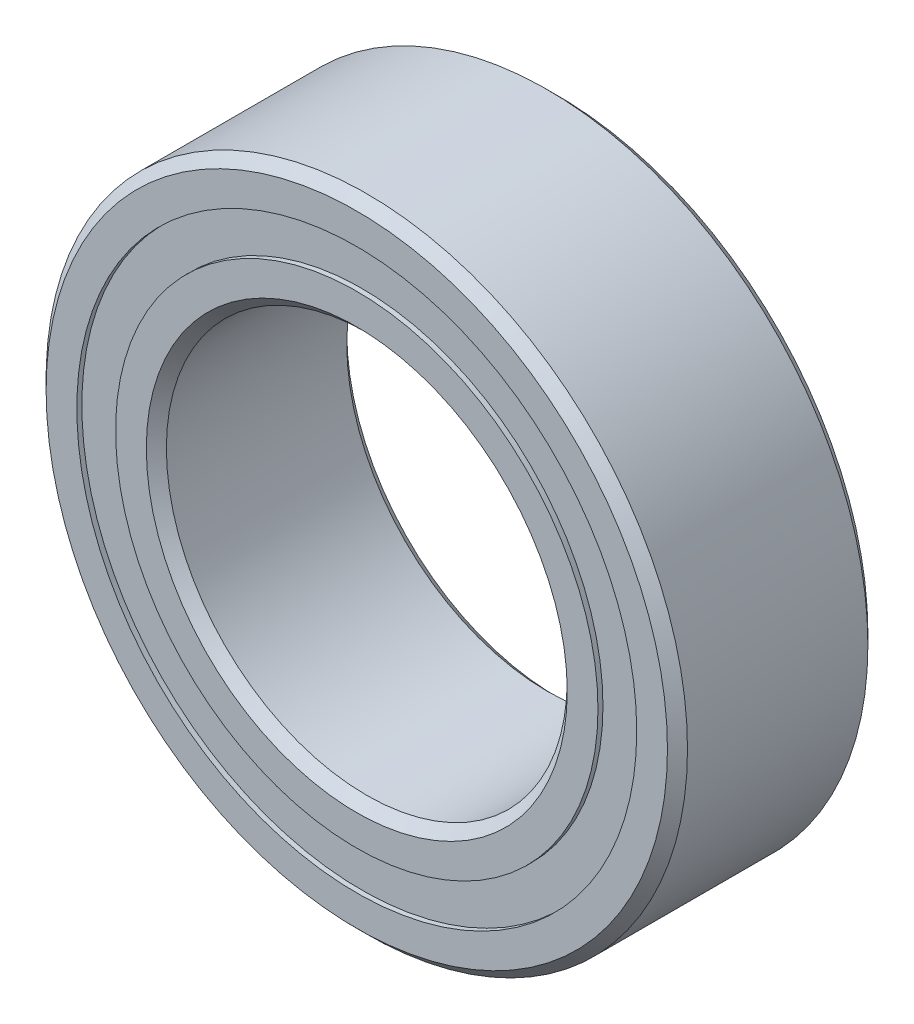
ISO-10303-21;
HEADER;
FILE_DESCRIPTION(('STEP AP214'),'2;1');
FILE_NAME('part.step','',(''),(''),'','','');
FILE_SCHEMA(('AUTOMOTIVE_DESIGN { 1 0 10303 214 1 1 1 1 }'));
ENDSEC;
DATA;
#1=APPLICATION_CONTEXT('core data for automotive mechanical design processes');
#2=APPLICATION_PROTOCOL_DEFINITION('international standard','automotive_design',2000,#1);
#3=PRODUCT_CONTEXT('',#1,'mechanical');
#4=PRODUCT('Part','Part','',(#3));
#5=PRODUCT_RELATED_PRODUCT_CATEGORY('part','',(#4));
#6=PRODUCT_DEFINITION_FORMATION('','',#4);
#7=PRODUCT_DEFINITION_CONTEXT('part definition',#1,'design');
#8=PRODUCT_DEFINITION('design','',#6,#7);
#9=PRODUCT_DEFINITION_SHAPE('','',#8);
#10=(LENGTH_UNIT() NAMED_UNIT(*) SI_UNIT(.MILLI.,.METRE.));
#11=(NAMED_UNIT(*) PLANE_ANGLE_UNIT() SI_UNIT($,.RADIAN.));
#12=(NAMED_UNIT(*) SI_UNIT($,.STERADIAN.) SOLID_ANGLE_UNIT());
#13=UNCERTAINTY_MEASURE_WITH_UNIT(LENGTH_MEASURE(1.E-05),#10,'distance_accuracy_value','');
#14=(GEOMETRIC_REPRESENTATION_CONTEXT(3) GLOBAL_UNCERTAINTY_ASSIGNED_CONTEXT((#13)) GLOBAL_UNIT_ASSIGNED_CONTEXT((#10,
#11,#12)) REPRESENTATION_CONTEXT('',''));
#15=CARTESIAN_POINT('',(0.,0.,0.));
#16=DIRECTION('',(0.,0.,1.));
#17=DIRECTION('',(1.,0.,0.));
#18=AXIS2_PLACEMENT_3D('',#15,#16,#17);
#19=CARTESIAN_POINT('',(0.,3.49175824175824,-1.1875));
#20=DIRECTION('',(0.,0.,1.));
#21=DIRECTION('',(1.,0.,0.));
#22=AXIS2_PLACEMENT_3D('',#19,#20,#21);
#23=PLANE('',#22);
#24=CARTESIAN_POINT('',(0.,0.,-1.1875));
#25=DIRECTION('',(0.,0.,1.));
#26=DIRECTION('',(1.,0.,0.));
#27=AXIS2_PLACEMENT_3D('',#24,#25,#26);
#28=CIRCLE('',#27,3.49175824175824);
#29=CARTESIAN_POINT('',(3.49175824175824,0.,-1.1875));
#30=VERTEX_POINT('',#29);
#31=EDGE_CURVE('E55',#30,#30,#28,.T.);
#32=ORIENTED_EDGE('',*,*,#31,.F.);
#33=EDGE_LOOP('',(#32));
#34=FACE_BOUND('',#33,.T.);
#35=CARTESIAN_POINT('',(0.,0.,-1.1875));
#36=DIRECTION('',(0.,0.,1.));
#37=DIRECTION('',(1.,0.,0.));
#38=AXIS2_PLACEMENT_3D('',#35,#36,#37);
#39=CIRCLE('',#38,3.00824175824176);
#40=CARTESIAN_POINT('',(3.00824175824176,0.,-1.1875));
#41=VERTEX_POINT('',#40);
#42=EDGE_CURVE('E11',#41,#41,#39,.T.);
#43=ORIENTED_EDGE('',*,*,#42,.T.);
#44=EDGE_LOOP('',(#43));
#45=FACE_BOUND('',#44,.T.);
#46=ADVANCED_FACE('F41',(#34,#45),#23,.F.);
#47=CARTESIAN_POINT('',(0.,0.,1.25));
#48=DIRECTION('',(0.,0.,1.));
#49=DIRECTION('',(1.,0.,0.));
#50=AXIS2_PLACEMENT_3D('',#47,#48,#49);
#51=CYLINDRICAL_SURFACE('',#50,3.00824175824176);
#52=ORIENTED_EDGE('',*,*,#42,.F.);
#53=EDGE_LOOP('',(#52));
#54=FACE_BOUND('',#53,.T.);
#55=CARTESIAN_POINT('',(0.,0.,-0.605878719519575));
#56=DIRECTION('',(0.,0.,1.));
#57=DIRECTION('',(1.,0.,0.));
#58=AXIS2_PLACEMENT_3D('',#55,#56,#57);
#59=CIRCLE('',#58,3.00824175824176);
#60=CARTESIAN_POINT('',(3.00824175824176,0.,-0.605878719519575));
#61=VERTEX_POINT('',#60);
#62=EDGE_CURVE('E47',#61,#61,#59,.T.);
#63=ORIENTED_EDGE('',*,*,#62,.T.);
#64=EDGE_LOOP('',(#63));
#65=FACE_BOUND('',#64,.T.);
#66=ADVANCED_FACE('F64',(#54,#65),#51,.F.);
#67=CARTESIAN_POINT('',(0.,3.49175824175824,-0.605878719519575));
#68=DIRECTION('',(0.,0.,-1.));
#69=DIRECTION('',(-1.,0.,0.));
#70=AXIS2_PLACEMENT_3D('',#67,#68,#69);
#71=PLANE('',#70);
#72=ORIENTED_EDGE('',*,*,#62,.F.);
#73=EDGE_LOOP('',(#72));
#74=FACE_BOUND('',#73,.T.);
#75=CARTESIAN_POINT('',(0.,0.,-0.605878719519575));
#76=DIRECTION('',(0.,0.,1.));
#77=DIRECTION('',(1.,0.,0.));
#78=AXIS2_PLACEMENT_3D('',#75,#76,#77);
#79=CIRCLE('',#78,3.49175824175824);
#80=CARTESIAN_POINT('',(3.49175824175824,0.,-0.605878719519575));
#81=VERTEX_POINT('',#80);
#82=EDGE_CURVE('E51',#81,#81,#79,.T.);
#83=ORIENTED_EDGE('',*,*,#82,.T.);
#84=EDGE_LOOP('',(#83));
#85=FACE_BOUND('',#84,.T.);
#86=ADVANCED_FACE('F68',(#74,#85),#71,.F.);
#87=CARTESIAN_POINT('',(0.,0.,1.25));
#88=DIRECTION('',(0.,0.,1.));
#89=DIRECTION('',(1.,0.,0.));
#90=AXIS2_PLACEMENT_3D('',#87,#88,#89);
#91=CYLINDRICAL_SURFACE('',#90,3.49175824175824);
#92=ORIENTED_EDGE('',*,*,#82,.F.);
#93=EDGE_LOOP('',(#92));
#94=FACE_BOUND('',#93,.T.);
#95=ORIENTED_EDGE('',*,*,#31,.T.);
#96=EDGE_LOOP('',(#95));
#97=FACE_BOUND('',#96,.T.);
#98=ADVANCED_FACE('F61',(#94,#97),#91,.T.);
#99=CLOSED_SHELL('',(#46,#66,#86,#98));
#100=MANIFOLD_SOLID_BREP('B2',#99);
#101=CARTESIAN_POINT('',(0.,3.49175824175824,1.1875));
#102=DIRECTION('',(0.,0.,-1.));
#103=DIRECTION('',(-1.,0.,0.));
#104=AXIS2_PLACEMENT_3D('',#101,#102,#103);
#105=PLANE('',#104);
#106=CARTESIAN_POINT('',(0.,0.,1.1875));
#107=DIRECTION('',(0.,0.,1.));
#108=DIRECTION('',(1.,0.,0.));
#109=AXIS2_PLACEMENT_3D('',#106,#107,#108);
#110=CIRCLE('',#109,3.00824175824176);
#111=CARTESIAN_POINT('',(3.00824175824176,0.,1.1875));
#112=VERTEX_POINT('',#111);
#113=EDGE_CURVE('E40',#112,#112,#110,.T.);
#114=ORIENTED_EDGE('',*,*,#113,.F.);
#115=EDGE_LOOP('',(#114));
#116=FACE_BOUND('',#115,.T.);
#117=CARTESIAN_POINT('',(0.,0.,1.1875));
#118=DIRECTION('',(0.,0.,1.));
#119=DIRECTION('',(1.,0.,0.));
#120=AXIS2_PLACEMENT_3D('',#117,#118,#119);
#121=CIRCLE('',#120,3.49175824175824);
#122=CARTESIAN_POINT('',(3.49175824175824,0.,1.1875));
#123=VERTEX_POINT('',#122);
#124=EDGE_CURVE('E122',#123,#123,#121,.T.);
#125=ORIENTED_EDGE('',*,*,#124,.T.);
#126=EDGE_LOOP('',(#125));
#127=FACE_BOUND('',#126,.T.);
#128=ADVANCED_FACE('F108',(#116,#127),#105,.F.);
#129=CARTESIAN_POINT('',(0.,0.,1.25));
#130=DIRECTION('',(0.,0.,1.));
#131=DIRECTION('',(1.,0.,0.));
#132=AXIS2_PLACEMENT_3D('',#129,#130,#131);
#133=CYLINDRICAL_SURFACE('',#132,3.00824175824176);
#134=CARTESIAN_POINT('',(0.,0.,0.605878719519573));
#135=DIRECTION('',(0.,0.,1.));
#136=DIRECTION('',(1.,0.,0.));
#137=AXIS2_PLACEMENT_3D('',#134,#135,#136);
#138=CIRCLE('',#137,3.00824175824176);
#139=CARTESIAN_POINT('',(3.00824175824176,0.,0.605878719519573));
#140=VERTEX_POINT('',#139);
#141=EDGE_CURVE('E114',#140,#140,#138,.T.);
#142=ORIENTED_EDGE('',*,*,#141,.F.);
#143=EDGE_LOOP('',(#142));
#144=FACE_BOUND('',#143,.T.);
#145=ORIENTED_EDGE('',*,*,#113,.T.);
#146=EDGE_LOOP('',(#145));
#147=FACE_BOUND('',#146,.T.);
#148=ADVANCED_FACE('F137',(#144,#147),#133,.F.);
#149=CARTESIAN_POINT('',(0.,3.49175824175824,0.605878719519573));
#150=DIRECTION('',(0.,0.,1.));
#151=DIRECTION('',(1.,0.,0.));
#152=AXIS2_PLACEMENT_3D('',#149,#150,#151);
#153=PLANE('',#152);
#154=CARTESIAN_POINT('',(0.,0.,0.605878719519573));
#155=DIRECTION('',(0.,0.,1.));
#156=DIRECTION('',(1.,0.,0.));
#157=AXIS2_PLACEMENT_3D('',#154,#155,#156);
#158=CIRCLE('',#157,3.49175824175824);
#159=CARTESIAN_POINT('',(3.49175824175824,0.,0.605878719519573));
#160=VERTEX_POINT('',#159);
#161=EDGE_CURVE('E118',#160,#160,#158,.T.);
#162=ORIENTED_EDGE('',*,*,#161,.F.);
#163=EDGE_LOOP('',(#162));
#164=FACE_BOUND('',#163,.T.);
#165=ORIENTED_EDGE('',*,*,#141,.T.);
#166=EDGE_LOOP('',(#165));
#167=FACE_BOUND('',#166,.T.);
#168=ADVANCED_FACE('F132',(#164,#167),#153,.F.);
#169=CARTESIAN_POINT('',(0.,0.,1.25));
#170=DIRECTION('',(0.,0.,1.));
#171=DIRECTION('',(1.,0.,0.));
#172=AXIS2_PLACEMENT_3D('',#169,#170,#171);
#173=CYLINDRICAL_SURFACE('',#172,3.49175824175824);
#174=ORIENTED_EDGE('',*,*,#124,.F.);
#175=EDGE_LOOP('',(#174));
#176=FACE_BOUND('',#175,.T.);
#177=ORIENTED_EDGE('',*,*,#161,.T.);
#178=EDGE_LOOP('',(#177));
#179=FACE_BOUND('',#178,.T.);
#180=ADVANCED_FACE('F129',(#176,#179),#173,.T.);
#181=CLOSED_SHELL('',(#128,#148,#168,#180));
#182=MANIFOLD_SOLID_BREP('B6',#181);
#183=CARTESIAN_POINT('',(-1.62499999999996,2.81458256229945,0.));
#184=DIRECTION('',(0.,0.,1.));
#185=DIRECTION('',(-0.499999999999989,0.866025403784445,0.));
#186=AXIS2_PLACEMENT_3D('',#183,#184,#185);
#187=SPHERICAL_SURFACE('',#186,0.605878719519574);
#188=CARTESIAN_POINT('',(-1.62499999999996,2.81458256229945,0.605878719519573));
#189=VERTEX_POINT('',#188);
#190=VERTEX_LOOP('',#189);
#191=FACE_BOUND('',#190,.T.);
#192=ADVANCED_FACE('F175',(#191),#187,.T.);
#193=CLOSED_SHELL('',(#192));
#194=MANIFOLD_SOLID_BREP('B35',#193);
#195=CARTESIAN_POINT('',(-2.81458256229941,1.62500000000003,0.));
#196=DIRECTION('',(0.,0.,1.));
#197=DIRECTION('',(-0.866025403784433,0.50000000000001,0.));
#198=AXIS2_PLACEMENT_3D('',#195,#196,#197);
#199=SPHERICAL_SURFACE('',#198,0.605878719519574);
#200=CARTESIAN_POINT('',(-2.81458256229941,1.62500000000003,0.605878719519573));
#201=VERTEX_POINT('',#200);
#202=VERTEX_LOOP('',#201);
#203=FACE_BOUND('',#202,.T.);
#204=ADVANCED_FACE('F195',(#203),#199,.T.);
#205=CLOSED_SHELL('',(#204));
#206=MANIFOLD_SOLID_BREP('B104',#205);
#207=CARTESIAN_POINT('',(-3.25,0.,0.));
#208=DIRECTION('',(0.,0.,1.));
#209=DIRECTION('',(-1.,0.,0.));
#210=AXIS2_PLACEMENT_3D('',#207,#208,#209);
#211=SPHERICAL_SURFACE('',#210,0.605878719519574);
#212=CARTESIAN_POINT('',(-3.25,0.,0.605878719519573));
#213=VERTEX_POINT('',#212);
#214=VERTEX_LOOP('',#213);
#215=FACE_BOUND('',#214,.T.);
#216=ADVANCED_FACE('F215',(#215),#211,.T.);
#217=CLOSED_SHELL('',(#216));
#218=MANIFOLD_SOLID_BREP('B171',#217);
#219=CARTESIAN_POINT('',(-2.81458256229944,-1.62499999999997,0.));
#220=DIRECTION('',(0.,0.,1.));
#221=DIRECTION('',(-0.866025403784443,-0.499999999999992,0.));
#222=AXIS2_PLACEMENT_3D('',#219,#220,#221);
#223=SPHERICAL_SURFACE('',#222,0.605878719519574);
#224=CARTESIAN_POINT('',(-2.81458256229944,-1.62499999999997,0.605878719519573));
#225=VERTEX_POINT('',#224);
#226=VERTEX_LOOP('',#225);
#227=FACE_BOUND('',#226,.T.);
#228=ADVANCED_FACE('F235',(#227),#223,.T.);
#229=CLOSED_SHELL('',(#228));
#230=MANIFOLD_SOLID_BREP('B191',#229);
#231=CARTESIAN_POINT('',(-1.62500000000002,-2.81458256229941,0.));
#232=DIRECTION('',(0.,0.,1.));
#233=DIRECTION('',(-0.500000000000007,-0.866025403784435,0.));
#234=AXIS2_PLACEMENT_3D('',#231,#232,#233);
#235=SPHERICAL_SURFACE('',#234,0.605878719519574);
#236=CARTESIAN_POINT('',(-1.62500000000002,-2.81458256229941,0.605878719519573));
#237=VERTEX_POINT('',#236);
#238=VERTEX_LOOP('',#237);
#239=FACE_BOUND('',#238,.T.);
#240=ADVANCED_FACE('F255',(#239),#235,.T.);
#241=CLOSED_SHELL('',(#240));
#242=MANIFOLD_SOLID_BREP('B211',#241);
#243=CARTESIAN_POINT('',(0.,-3.25,0.));
#244=DIRECTION('',(0.,0.,1.));
#245=DIRECTION('',(0.,-1.,0.));
#246=AXIS2_PLACEMENT_3D('',#243,#244,#245);
#247=SPHERICAL_SURFACE('',#246,0.605878719519574);
#248=CARTESIAN_POINT('',(0.,-3.25,0.605878719519573));
#249=VERTEX_POINT('',#248);
#250=VERTEX_LOOP('',#249);
#251=FACE_BOUND('',#250,.T.);
#252=ADVANCED_FACE('F275',(#251),#247,.T.);
#253=CLOSED_SHELL('',(#252));
#254=MANIFOLD_SOLID_BREP('B231',#253);
#255=CARTESIAN_POINT('',(1.62499999999998,-2.81458256229944,0.));
#256=DIRECTION('',(0.,0.,1.));
#257=DIRECTION('',(0.499999999999995,-0.866025403784442,0.));
#258=AXIS2_PLACEMENT_3D('',#255,#256,#257);
#259=SPHERICAL_SURFACE('',#258,0.605878719519574);
#260=CARTESIAN_POINT('',(1.62499999999998,-2.81458256229944,0.605878719519573));
#261=VERTEX_POINT('',#260);
#262=VERTEX_LOOP('',#261);
#263=FACE_BOUND('',#262,.T.);
#264=ADVANCED_FACE('F295',(#263),#259,.T.);
#265=CLOSED_SHELL('',(#264));
#266=MANIFOLD_SOLID_BREP('B251',#265);
#267=CARTESIAN_POINT('',(2.81458256229942,-1.62500000000001,0.));
#268=DIRECTION('',(0.,0.,1.));
#269=DIRECTION('',(0.866025403784436,-0.500000000000004,0.));
#270=AXIS2_PLACEMENT_3D('',#267,#268,#269);
#271=SPHERICAL_SURFACE('',#270,0.605878719519574);
#272=CARTESIAN_POINT('',(2.81458256229942,-1.62500000000001,0.605878719519573));
#273=VERTEX_POINT('',#272);
#274=VERTEX_LOOP('',#273);
#275=FACE_BOUND('',#274,.T.);
#276=ADVANCED_FACE('F315',(#275),#271,.T.);
#277=CLOSED_SHELL('',(#276));
#278=MANIFOLD_SOLID_BREP('B271',#277);
#279=CARTESIAN_POINT('',(3.25,0.,0.));
#280=DIRECTION('',(0.,0.,1.));
#281=DIRECTION('',(1.,0.,0.));
#282=AXIS2_PLACEMENT_3D('',#279,#280,#281);
#283=SPHERICAL_SURFACE('',#282,0.605878719519574);
#284=CARTESIAN_POINT('',(3.25,0.,0.605878719519573));
#285=VERTEX_POINT('',#284);
#286=VERTEX_LOOP('',#285);
#287=FACE_BOUND('',#286,.T.);
#288=ADVANCED_FACE('F335',(#287),#283,.T.);
#289=CLOSED_SHELL('',(#288));
#290=MANIFOLD_SOLID_BREP('B291',#289);
#291=CARTESIAN_POINT('',(2.81458256229943,1.62499999999999,0.));
#292=DIRECTION('',(0.,0.,1.));
#293=DIRECTION('',(0.86602540378444,0.499999999999998,0.));
#294=AXIS2_PLACEMENT_3D('',#291,#292,#293);
#295=SPHERICAL_SURFACE('',#294,0.605878719519574);
#296=CARTESIAN_POINT('',(2.81458256229943,1.62499999999999,0.605878719519573));
#297=VERTEX_POINT('',#296);
#298=VERTEX_LOOP('',#297);
#299=FACE_BOUND('',#298,.T.);
#300=ADVANCED_FACE('F355',(#299),#295,.T.);
#301=CLOSED_SHELL('',(#300));
#302=MANIFOLD_SOLID_BREP('B311',#301);
#303=CARTESIAN_POINT('',(1.625,2.81458256229942,0.));
#304=DIRECTION('',(0.,0.,1.));
#305=DIRECTION('',(0.500000000000001,0.866025403784438,0.));
#306=AXIS2_PLACEMENT_3D('',#303,#304,#305);
#307=SPHERICAL_SURFACE('',#306,0.605878719519574);
#308=CARTESIAN_POINT('',(1.625,2.81458256229942,0.605878719519573));
#309=VERTEX_POINT('',#308);
#310=VERTEX_LOOP('',#309);
#311=FACE_BOUND('',#310,.T.);
#312=ADVANCED_FACE('F375',(#311),#307,.T.);
#313=CLOSED_SHELL('',(#312));
#314=MANIFOLD_SOLID_BREP('B331',#313);
#315=CARTESIAN_POINT('',(0.,3.25,0.));
#316=DIRECTION('',(0.,0.,1.));
#317=DIRECTION('',(0.,1.,0.));
#318=AXIS2_PLACEMENT_3D('',#315,#316,#317);
#319=SPHERICAL_SURFACE('',#318,0.605878719519574);
#320=CARTESIAN_POINT('',(0.,3.25,0.605878719519573));
#321=VERTEX_POINT('',#320);
#322=VERTEX_LOOP('',#321);
#323=FACE_BOUND('',#322,.T.);
#324=ADVANCED_FACE('F397',(#323),#319,.T.);
#325=CLOSED_SHELL('',(#324));
#326=MANIFOLD_SOLID_BREP('B351',#325);
#327=CARTESIAN_POINT('',(0.,3.00824175824176,1.25));
#328=DIRECTION('',(0.,0.,-1.));
#329=DIRECTION('',(-1.,0.,0.));
#330=AXIS2_PLACEMENT_3D('',#327,#328,#329);
#331=PLANE('',#330);
#332=CARTESIAN_POINT('',(0.,0.,1.25));
#333=DIRECTION('',(0.,0.,1.));
#334=DIRECTION('',(1.,0.,0.));
#335=AXIS2_PLACEMENT_3D('',#332,#333,#334);
#336=CIRCLE('',#335,2.625);
#337=CARTESIAN_POINT('',(2.625,0.,1.25));
#338=VERTEX_POINT('',#337);
#339=EDGE_CURVE('E444',#338,#338,#336,.T.);
#340=ORIENTED_EDGE('',*,*,#339,.F.);
#341=EDGE_LOOP('',(#340));
#342=FACE_BOUND('',#341,.T.);
#343=CARTESIAN_POINT('',(0.,0.,1.25));
#344=DIRECTION('',(0.,0.,1.));
#345=DIRECTION('',(1.,0.,0.));
#346=AXIS2_PLACEMENT_3D('',#343,#344,#345);
#347=CIRCLE('',#346,3.00824175824176);
#348=CARTESIAN_POINT('',(3.00824175824176,0.,1.25));
#349=VERTEX_POINT('',#348);
#350=EDGE_CURVE('E396',#349,#349,#347,.T.);
#351=ORIENTED_EDGE('',*,*,#350,.T.);
#352=EDGE_LOOP('',(#351));
#353=FACE_BOUND('',#352,.T.);
#354=ADVANCED_FACE('F416',(#342,#353),#331,.F.);
#355=CARTESIAN_POINT('',(0.,0.,1.25));
#356=DIRECTION('',(0.,0.,1.));
#357=DIRECTION('',(1.,0.,0.));
#358=AXIS2_PLACEMENT_3D('',#355,#356,#357);
#359=CYLINDRICAL_SURFACE('',#358,3.00824175824176);
#360=ORIENTED_EDGE('',*,*,#350,.F.);
#361=EDGE_LOOP('',(#360));
#362=FACE_BOUND('',#361,.T.);
#363=CARTESIAN_POINT('',(0.,0.,0.555555555555555));
#364=DIRECTION('',(0.,0.,1.));
#365=DIRECTION('',(1.,0.,0.));
#366=AXIS2_PLACEMENT_3D('',#363,#364,#365);
#367=CIRCLE('',#366,3.00824175824176);
#368=CARTESIAN_POINT('',(3.00824175824176,0.,0.555555555555555));
#369=VERTEX_POINT('',#368);
#370=EDGE_CURVE('E422',#369,#369,#367,.T.);
#371=ORIENTED_EDGE('',*,*,#370,.T.);
#372=EDGE_LOOP('',(#371));
#373=FACE_BOUND('',#372,.T.);
#374=ADVANCED_FACE('F451',(#362,#373),#359,.T.);
#375=CARTESIAN_POINT('',(0.,0.,0.));
#376=DIRECTION('',(0.,0.,1.));
#377=DIRECTION('',(1.,0.,0.));
#378=AXIS2_PLACEMENT_3D('',#375,#376,#377);
#379=TOROIDAL_SURFACE('',#378,3.25,0.605878719519573);
#380=ORIENTED_EDGE('',*,*,#370,.F.);
#381=EDGE_LOOP('',(#380));
#382=FACE_BOUND('',#381,.T.);
#383=CARTESIAN_POINT('',(0.,0.,-0.555555555555557));
#384=DIRECTION('',(0.,0.,1.));
#385=DIRECTION('',(1.,0.,0.));
#386=AXIS2_PLACEMENT_3D('',#383,#384,#385);
#387=CIRCLE('',#386,3.00824175824176);
#388=CARTESIAN_POINT('',(3.00824175824176,0.,-0.555555555555557));
#389=VERTEX_POINT('',#388);
#390=EDGE_CURVE('E426',#389,#389,#387,.T.);
#391=ORIENTED_EDGE('',*,*,#390,.T.);
#392=EDGE_LOOP('',(#391));
#393=FACE_BOUND('',#392,.T.);
#394=ADVANCED_FACE('F455',(#382,#393),#379,.F.);
#395=CARTESIAN_POINT('',(0.,0.,1.25));
#396=DIRECTION('',(0.,0.,1.));
#397=DIRECTION('',(1.,0.,0.));
#398=AXIS2_PLACEMENT_3D('',#395,#396,#397);
#399=CYLINDRICAL_SURFACE('',#398,3.00824175824176);
#400=ORIENTED_EDGE('',*,*,#390,.F.);
#401=EDGE_LOOP('',(#400));
#402=FACE_BOUND('',#401,.T.);
#403=CARTESIAN_POINT('',(0.,0.,-1.25));
#404=DIRECTION('',(0.,0.,1.));
#405=DIRECTION('',(1.,0.,0.));
#406=AXIS2_PLACEMENT_3D('',#403,#404,#405);
#407=CIRCLE('',#406,3.00824175824176);
#408=CARTESIAN_POINT('',(3.00824175824176,0.,-1.25));
#409=VERTEX_POINT('',#408);
#410=EDGE_CURVE('E430',#409,#409,#407,.T.);
#411=ORIENTED_EDGE('',*,*,#410,.T.);
#412=EDGE_LOOP('',(#411));
#413=FACE_BOUND('',#412,.T.);
#414=ADVANCED_FACE('F460',(#402,#413),#399,.T.);
#415=CARTESIAN_POINT('',(0.,2.625,-1.25));
#416=DIRECTION('',(0.,0.,1.));
#417=DIRECTION('',(1.,0.,0.));
#418=AXIS2_PLACEMENT_3D('',#415,#416,#417);
#419=PLANE('',#418);
#420=ORIENTED_EDGE('',*,*,#410,.F.);
#421=EDGE_LOOP('',(#420));
#422=FACE_BOUND('',#421,.T.);
#423=CARTESIAN_POINT('',(0.,0.,-1.25));
#424=DIRECTION('',(0.,0.,1.));
#425=DIRECTION('',(1.,0.,0.));
#426=AXIS2_PLACEMENT_3D('',#423,#424,#425);
#427=CIRCLE('',#426,2.625);
#428=CARTESIAN_POINT('',(2.625,0.,-1.25));
#429=VERTEX_POINT('',#428);
#430=EDGE_CURVE('E435',#429,#429,#427,.T.);
#431=ORIENTED_EDGE('',*,*,#430,.T.);
#432=EDGE_LOOP('',(#431));
#433=FACE_BOUND('',#432,.T.);
#434=ADVANCED_FACE('F466',(#422,#433),#419,.F.);
#435=CARTESIAN_POINT('',(0.,0.,-1.125));
#436=DIRECTION('',(0.,0.,-1.));
#437=DIRECTION('',(-1.,0.,0.));
#438=AXIS2_PLACEMENT_3D('',#435,#436,#437);
#439=CONICAL_SURFACE('',#438,2.5,0.78539816339745);
#440=ORIENTED_EDGE('',*,*,#430,.F.);
#441=EDGE_LOOP('',(#440));
#442=FACE_BOUND('',#441,.T.);
#443=CARTESIAN_POINT('',(0.,0.,-1.125));
#444=DIRECTION('',(0.,0.,1.));
#445=DIRECTION('',(1.,0.,0.));
#446=AXIS2_PLACEMENT_3D('',#443,#444,#445);
#447=CIRCLE('',#446,2.5);
#448=CARTESIAN_POINT('',(2.5,0.,-1.125));
#449=VERTEX_POINT('',#448);
#450=EDGE_CURVE('E438',#449,#449,#447,.T.);
#451=ORIENTED_EDGE('',*,*,#450,.T.);
#452=EDGE_LOOP('',(#451));
#453=FACE_BOUND('',#452,.T.);
#454=ADVANCED_FACE('F470',(#442,#453),#439,.F.);
#455=CARTESIAN_POINT('',(0.,0.,1.25));
#456=DIRECTION('',(0.,0.,1.));
#457=DIRECTION('',(1.,0.,0.));
#458=AXIS2_PLACEMENT_3D('',#455,#456,#457);
#459=CYLINDRICAL_SURFACE('',#458,2.5);
#460=ORIENTED_EDGE('',*,*,#450,.F.);
#461=EDGE_LOOP('',(#460));
#462=FACE_BOUND('',#461,.T.);
#463=CARTESIAN_POINT('',(0.,0.,1.125));
#464=DIRECTION('',(0.,0.,1.));
#465=DIRECTION('',(1.,0.,0.));
#466=AXIS2_PLACEMENT_3D('',#463,#464,#465);
#467=CIRCLE('',#466,2.5);
#468=CARTESIAN_POINT('',(2.5,0.,1.125));
#469=VERTEX_POINT('',#468);
#470=EDGE_CURVE('E441',#469,#469,#467,.T.);
#471=ORIENTED_EDGE('',*,*,#470,.T.);
#472=EDGE_LOOP('',(#471));
#473=FACE_BOUND('',#472,.T.);
#474=ADVANCED_FACE('F474',(#462,#473),#459,.F.);
#475=CARTESIAN_POINT('',(0.,0.,1.25));
#476=DIRECTION('',(0.,0.,1.));
#477=DIRECTION('',(1.,0.,0.));
#478=AXIS2_PLACEMENT_3D('',#475,#476,#477);
#479=CONICAL_SURFACE('',#478,2.625,0.785398163397447);
#480=ORIENTED_EDGE('',*,*,#470,.F.);
#481=EDGE_LOOP('',(#480));
#482=FACE_BOUND('',#481,.T.);
#483=ORIENTED_EDGE('',*,*,#339,.T.);
#484=EDGE_LOOP('',(#483));
#485=FACE_BOUND('',#484,.T.);
#486=ADVANCED_FACE('F448',(#482,#485),#479,.F.);
#487=CLOSED_SHELL('',(#354,#374,#394,#414,#434,#454,#474,#486));
#488=MANIFOLD_SOLID_BREP('B371',#487);
#489=CARTESIAN_POINT('',(0.,0.,1.125));
#490=DIRECTION('',(0.,0.,-1.));
#491=DIRECTION('',(-1.,0.,0.));
#492=AXIS2_PLACEMENT_3D('',#489,#490,#491);
#493=CONICAL_SURFACE('',#492,4.,0.785398163397451);
#494=CARTESIAN_POINT('',(0.,0.,1.25));
#495=DIRECTION('',(0.,0.,1.));
#496=DIRECTION('',(1.,0.,0.));
#497=AXIS2_PLACEMENT_3D('',#494,#495,#496);
#498=CIRCLE('',#497,3.875);
#499=CARTESIAN_POINT('',(3.875,0.,1.25));
#500=VERTEX_POINT('',#499);
#501=EDGE_CURVE('E565',#500,#500,#498,.T.);
#502=ORIENTED_EDGE('',*,*,#501,.F.);
#503=EDGE_LOOP('',(#502));
#504=FACE_BOUND('',#503,.T.);
#505=CARTESIAN_POINT('',(0.,0.,1.125));
#506=DIRECTION('',(0.,0.,1.));
#507=DIRECTION('',(1.,0.,0.));
#508=AXIS2_PLACEMENT_3D('',#505,#506,#507);
#509=CIRCLE('',#508,4.);
#510=CARTESIAN_POINT('',(4.,0.,1.125));
#511=VERTEX_POINT('',#510);
#512=EDGE_CURVE('E415',#511,#511,#509,.T.);
#513=ORIENTED_EDGE('',*,*,#512,.T.);
#514=EDGE_LOOP('',(#513));
#515=FACE_BOUND('',#514,.T.);
#516=ADVANCED_FACE('F537',(#504,#515),#493,.T.);
#517=CARTESIAN_POINT('',(0.,0.,1.25));
#518=DIRECTION('',(0.,0.,1.));
#519=DIRECTION('',(1.,0.,0.));
#520=AXIS2_PLACEMENT_3D('',#517,#518,#519);
#521=CYLINDRICAL_SURFACE('',#520,4.);
#522=ORIENTED_EDGE('',*,*,#512,.F.);
#523=EDGE_LOOP('',(#522));
#524=FACE_BOUND('',#523,.T.);
#525=CARTESIAN_POINT('',(0.,0.,-1.125));
#526=DIRECTION('',(0.,0.,1.));
#527=DIRECTION('',(1.,0.,0.));
#528=AXIS2_PLACEMENT_3D('',#525,#526,#527);
#529=CIRCLE('',#528,4.);
#530=CARTESIAN_POINT('',(4.,0.,-1.125));
#531=VERTEX_POINT('',#530);
#532=EDGE_CURVE('E543',#531,#531,#529,.T.);
#533=ORIENTED_EDGE('',*,*,#532,.T.);
#534=EDGE_LOOP('',(#533));
#535=FACE_BOUND('',#534,.T.);
#536=ADVANCED_FACE('F572',(#524,#535),#521,.T.);
#537=CARTESIAN_POINT('',(0.,0.,-1.25));
#538=DIRECTION('',(0.,0.,1.));
#539=DIRECTION('',(1.,0.,0.));
#540=AXIS2_PLACEMENT_3D('',#537,#538,#539);
#541=CONICAL_SURFACE('',#540,3.875,0.78539816339745);
#542=ORIENTED_EDGE('',*,*,#532,.F.);
#543=EDGE_LOOP('',(#542));
#544=FACE_BOUND('',#543,.T.);
#545=CARTESIAN_POINT('',(0.,0.,-1.25));
#546=DIRECTION('',(0.,0.,1.));
#547=DIRECTION('',(1.,0.,0.));
#548=AXIS2_PLACEMENT_3D('',#545,#546,#547);
#549=CIRCLE('',#548,3.875);
#550=CARTESIAN_POINT('',(3.875,0.,-1.25));
#551=VERTEX_POINT('',#550);
#552=EDGE_CURVE('E547',#551,#551,#549,.T.);
#553=ORIENTED_EDGE('',*,*,#552,.T.);
#554=EDGE_LOOP('',(#553));
#555=FACE_BOUND('',#554,.T.);
#556=ADVANCED_FACE('F576',(#544,#555),#541,.T.);
#557=CARTESIAN_POINT('',(0.,3.875,-1.25));
#558=DIRECTION('',(0.,0.,1.));
#559=DIRECTION('',(1.,0.,0.));
#560=AXIS2_PLACEMENT_3D('',#557,#558,#559);
#561=PLANE('',#560);
#562=ORIENTED_EDGE('',*,*,#552,.F.);
#563=EDGE_LOOP('',(#562));
#564=FACE_BOUND('',#563,.T.);
#565=CARTESIAN_POINT('',(0.,0.,-1.25));
#566=DIRECTION('',(0.,0.,1.));
#567=DIRECTION('',(1.,0.,0.));
#568=AXIS2_PLACEMENT_3D('',#565,#566,#567);
#569=CIRCLE('',#568,3.49175824175824);
#570=CARTESIAN_POINT('',(3.49175824175824,0.,-1.25));
#571=VERTEX_POINT('',#570);
#572=EDGE_CURVE('E551',#571,#571,#569,.T.);
#573=ORIENTED_EDGE('',*,*,#572,.T.);
#574=EDGE_LOOP('',(#573));
#575=FACE_BOUND('',#574,.T.);
#576=ADVANCED_FACE('F581',(#564,#575),#561,.F.);
#577=CARTESIAN_POINT('',(0.,0.,1.25));
#578=DIRECTION('',(0.,0.,1.));
#579=DIRECTION('',(1.,0.,0.));
#580=AXIS2_PLACEMENT_3D('',#577,#578,#579);
#581=CYLINDRICAL_SURFACE('',#580,3.49175824175824);
#582=ORIENTED_EDGE('',*,*,#572,.F.);
#583=EDGE_LOOP('',(#582));
#584=FACE_BOUND('',#583,.T.);
#585=CARTESIAN_POINT('',(0.,0.,-0.555555555555556));
#586=DIRECTION('',(0.,0.,1.));
#587=DIRECTION('',(1.,0.,0.));
#588=AXIS2_PLACEMENT_3D('',#585,#586,#587);
#589=CIRCLE('',#588,3.49175824175824);
#590=CARTESIAN_POINT('',(3.49175824175824,0.,-0.555555555555556));
#591=VERTEX_POINT('',#590);
#592=EDGE_CURVE('E556',#591,#591,#589,.T.);
#593=ORIENTED_EDGE('',*,*,#592,.T.);
#594=EDGE_LOOP('',(#593));
#595=FACE_BOUND('',#594,.T.);
#596=ADVANCED_FACE('F587',(#584,#595),#581,.F.);
#597=CARTESIAN_POINT('',(0.,0.,0.));
#598=DIRECTION('',(0.,0.,1.));
#599=DIRECTION('',(1.,0.,0.));
#600=AXIS2_PLACEMENT_3D('',#597,#598,#599);
#601=TOROIDAL_SURFACE('',#600,3.25,0.605878719519574);
#602=ORIENTED_EDGE('',*,*,#592,.F.);
#603=EDGE_LOOP('',(#602));
#604=FACE_BOUND('',#603,.T.);
#605=CARTESIAN_POINT('',(0.,0.,0.555555555555555));
#606=DIRECTION('',(0.,0.,1.));
#607=DIRECTION('',(1.,0.,0.));
#608=AXIS2_PLACEMENT_3D('',#605,#606,#607);
#609=CIRCLE('',#608,3.49175824175824);
#610=CARTESIAN_POINT('',(3.49175824175824,0.,0.555555555555555));
#611=VERTEX_POINT('',#610);
#612=EDGE_CURVE('E559',#611,#611,#609,.T.);
#613=ORIENTED_EDGE('',*,*,#612,.T.);
#614=EDGE_LOOP('',(#613));
#615=FACE_BOUND('',#614,.T.);
#616=ADVANCED_FACE('F591',(#604,#615),#601,.F.);
#617=CARTESIAN_POINT('',(0.,0.,1.25));
#618=DIRECTION('',(0.,0.,1.));
#619=DIRECTION('',(1.,0.,0.));
#620=AXIS2_PLACEMENT_3D('',#617,#618,#619);
#621=CYLINDRICAL_SURFACE('',#620,3.49175824175824);
#622=ORIENTED_EDGE('',*,*,#612,.F.);
#623=EDGE_LOOP('',(#622));
#624=FACE_BOUND('',#623,.T.);
#625=CARTESIAN_POINT('',(0.,0.,1.25));
#626=DIRECTION('',(0.,0.,1.));
#627=DIRECTION('',(1.,0.,0.));
#628=AXIS2_PLACEMENT_3D('',#625,#626,#627);
#629=CIRCLE('',#628,3.49175824175824);
#630=CARTESIAN_POINT('',(3.49175824175824,0.,1.25));
#631=VERTEX_POINT('',#630);
#632=EDGE_CURVE('E562',#631,#631,#629,.T.);
#633=ORIENTED_EDGE('',*,*,#632,.T.);
#634=EDGE_LOOP('',(#633));
#635=FACE_BOUND('',#634,.T.);
#636=ADVANCED_FACE('F595',(#624,#635),#621,.F.);
#637=CARTESIAN_POINT('',(0.,3.875,1.25));
#638=DIRECTION('',(0.,0.,-1.));
#639=DIRECTION('',(-1.,0.,0.));
#640=AXIS2_PLACEMENT_3D('',#637,#638,#639);
#641=PLANE('',#640);
#642=ORIENTED_EDGE('',*,*,#632,.F.);
#643=EDGE_LOOP('',(#642));
#644=FACE_BOUND('',#643,.T.);
#645=ORIENTED_EDGE('',*,*,#501,.T.);
#646=EDGE_LOOP('',(#645));
#647=FACE_BOUND('',#646,.T.);
#648=ADVANCED_FACE('F569',(#644,#647),#641,.F.);
#649=CLOSED_SHELL('',(#516,#536,#556,#576,#596,#616,#636,#648));
#650=MANIFOLD_SOLID_BREP('B391',#649);
#651=ADVANCED_BREP_SHAPE_REPRESENTATION('',(#18,#100,#182,#194,#206,#218,#230,#242,#254,#266,
#278,#290,#302,#314,#326,#488,#650),#14);
#652=SHAPE_DEFINITION_REPRESENTATION(#9,#651);
ENDSEC;
END-ISO-10303-21;
